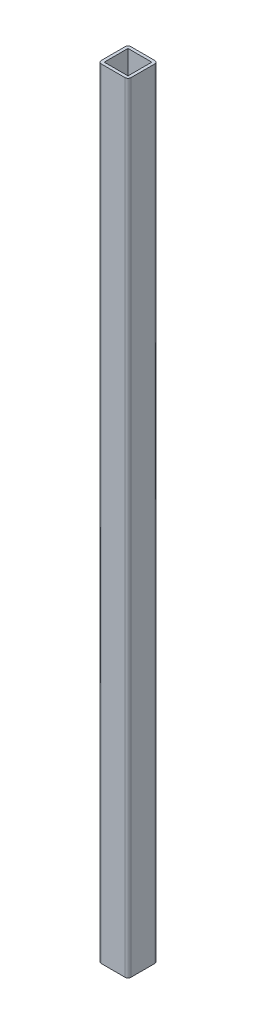
ISO-10303-21;
HEADER;
FILE_DESCRIPTION(('STEP AP214'),'2;1');
FILE_NAME('part.step','',(''),(''),'','','');
FILE_SCHEMA(('AUTOMOTIVE_DESIGN { 1 0 10303 214 1 1 1 1 }'));
ENDSEC;
DATA;
#1=APPLICATION_CONTEXT('core data for automotive mechanical design processes');
#2=APPLICATION_PROTOCOL_DEFINITION('international standard','automotive_design',2000,#1);
#3=PRODUCT_CONTEXT('',#1,'mechanical');
#4=PRODUCT('Part','Part','',(#3));
#5=PRODUCT_RELATED_PRODUCT_CATEGORY('part','',(#4));
#6=PRODUCT_DEFINITION_FORMATION('','',#4);
#7=PRODUCT_DEFINITION_CONTEXT('part definition',#1,'design');
#8=PRODUCT_DEFINITION('design','',#6,#7);
#9=PRODUCT_DEFINITION_SHAPE('','',#8);
#10=(LENGTH_UNIT() NAMED_UNIT(*) SI_UNIT(.MILLI.,.METRE.));
#11=(NAMED_UNIT(*) PLANE_ANGLE_UNIT() SI_UNIT($,.RADIAN.));
#12=(NAMED_UNIT(*) SI_UNIT($,.STERADIAN.) SOLID_ANGLE_UNIT());
#13=UNCERTAINTY_MEASURE_WITH_UNIT(LENGTH_MEASURE(1.E-05),#10,'distance_accuracy_value','');
#14=(GEOMETRIC_REPRESENTATION_CONTEXT(3) GLOBAL_UNCERTAINTY_ASSIGNED_CONTEXT((#13)) GLOBAL_UNIT_ASSIGNED_CONTEXT((#10,
#11,#12)) REPRESENTATION_CONTEXT('',''));
#15=CARTESIAN_POINT('',(0.,0.,0.));
#16=DIRECTION('',(0.,0.,1.));
#17=DIRECTION('',(1.,0.,0.));
#18=AXIS2_PLACEMENT_3D('',#15,#16,#17);
#19=CARTESIAN_POINT('',(-15.875,0.,-15.875));
#20=DIRECTION('',(-1.,0.,0.));
#21=DIRECTION('',(0.,0.,1.));
#22=AXIS2_PLACEMENT_3D('',#19,#20,#21);
#23=PLANE('',#22);
#24=DIRECTION('',(0.,-1.,0.));
#25=VECTOR('',#24,1.);
#26=CARTESIAN_POINT('',(-15.875,1916.24966,12.7));
#27=LINE('',#26,#25);
#28=CARTESIAN_POINT('',(-15.875,831.85,12.7));
#29=VERTEX_POINT('',#28);
#30=CARTESIAN_POINT('',(-15.875,0.,12.7));
#31=VERTEX_POINT('',#30);
#32=EDGE_CURVE('E167',#29,#31,#27,.T.);
#33=ORIENTED_EDGE('',*,*,#32,.F.);
#34=DIRECTION('',(0.,0.,1.));
#35=VECTOR('',#34,1.);
#36=CARTESIAN_POINT('',(-15.875,831.85,0.));
#37=LINE('',#36,#35);
#38=CARTESIAN_POINT('',(-15.875,831.85,-12.7));
#39=VERTEX_POINT('',#38);
#40=EDGE_CURVE('E99',#39,#29,#37,.T.);
#41=ORIENTED_EDGE('',*,*,#40,.F.);
#42=DIRECTION('',(0.,-1.,0.));
#43=VECTOR('',#42,1.);
#44=CARTESIAN_POINT('',(-15.875,1916.24966,-12.7));
#45=LINE('',#44,#43);
#46=CARTESIAN_POINT('',(-15.875,0.,-12.7));
#47=VERTEX_POINT('',#46);
#48=EDGE_CURVE('E94',#47,#39,#45,.F.);
#49=ORIENTED_EDGE('',*,*,#48,.F.);
#50=DIRECTION('',(0.,0.,1.));
#51=VECTOR('',#50,1.);
#52=CARTESIAN_POINT('',(-15.875,0.,0.));
#53=LINE('',#52,#51);
#54=EDGE_CURVE('E96',#47,#31,#53,.T.);
#55=ORIENTED_EDGE('',*,*,#54,.T.);
#56=EDGE_LOOP('',(#33,#41,#49,#55));
#57=FACE_BOUND('',#56,.T.);
#58=ADVANCED_FACE('F16',(#57),#23,.T.);
#59=CARTESIAN_POINT('',(-12.7,1916.24966,12.7));
#60=DIRECTION('',(0.,-1.,0.));
#61=DIRECTION('',(0.,0.,-1.));
#62=AXIS2_PLACEMENT_3D('',#59,#60,#61);
#63=CYLINDRICAL_SURFACE('',#62,3.175);
#64=CARTESIAN_POINT('',(-12.7,831.85,12.7));
#65=DIRECTION('',(0.,-1.,0.));
#66=DIRECTION('',(0.,0.,-1.));
#67=AXIS2_PLACEMENT_3D('',#64,#65,#66);
#68=CIRCLE('',#67,3.175);
#69=CARTESIAN_POINT('',(-12.7,831.85,15.875));
#70=VERTEX_POINT('',#69);
#71=EDGE_CURVE('E145',#29,#70,#68,.F.);
#72=ORIENTED_EDGE('',*,*,#71,.F.);
#73=ORIENTED_EDGE('',*,*,#32,.T.);
#74=CARTESIAN_POINT('',(-12.7,0.,12.7));
#75=DIRECTION('',(0.,-1.,0.));
#76=DIRECTION('',(0.,0.,-1.));
#77=AXIS2_PLACEMENT_3D('',#74,#75,#76);
#78=CIRCLE('',#77,3.175);
#79=CARTESIAN_POINT('',(-12.7,0.,15.875));
#80=VERTEX_POINT('',#79);
#81=EDGE_CURVE('E110',#31,#80,#78,.F.);
#82=ORIENTED_EDGE('',*,*,#81,.T.);
#83=DIRECTION('',(0.,1.,0.));
#84=VECTOR('',#83,1.);
#85=CARTESIAN_POINT('',(-12.7,0.,15.875));
#86=LINE('',#85,#84);
#87=EDGE_CURVE('E164',#70,#80,#86,.F.);
#88=ORIENTED_EDGE('',*,*,#87,.F.);
#89=EDGE_LOOP('',(#72,#73,#82,#88));
#90=FACE_BOUND('',#89,.T.);
#91=ADVANCED_FACE('F182',(#90),#63,.T.);
#92=CARTESIAN_POINT('',(-15.875,0.,15.875));
#93=DIRECTION('',(0.,0.,1.));
#94=DIRECTION('',(1.,0.,0.));
#95=AXIS2_PLACEMENT_3D('',#92,#93,#94);
#96=PLANE('',#95);
#97=DIRECTION('',(0.,-1.,0.));
#98=VECTOR('',#97,1.);
#99=CARTESIAN_POINT('',(12.7,1916.24966,15.875));
#100=LINE('',#99,#98);
#101=CARTESIAN_POINT('',(12.7,831.85,15.875));
#102=VERTEX_POINT('',#101);
#103=CARTESIAN_POINT('',(12.7,0.,15.875));
#104=VERTEX_POINT('',#103);
#105=EDGE_CURVE('E161',#102,#104,#100,.T.);
#106=ORIENTED_EDGE('',*,*,#105,.F.);
#107=DIRECTION('',(1.,0.,0.));
#108=VECTOR('',#107,1.);
#109=CARTESIAN_POINT('',(0.,831.85,15.875));
#110=LINE('',#109,#108);
#111=EDGE_CURVE('E142',#70,#102,#110,.T.);
#112=ORIENTED_EDGE('',*,*,#111,.F.);
#113=ORIENTED_EDGE('',*,*,#87,.T.);
#114=DIRECTION('',(1.,0.,0.));
#115=VECTOR('',#114,1.);
#116=CARTESIAN_POINT('',(0.,0.,15.875));
#117=LINE('',#116,#115);
#118=EDGE_CURVE('E113',#80,#104,#117,.T.);
#119=ORIENTED_EDGE('',*,*,#118,.T.);
#120=EDGE_LOOP('',(#106,#112,#113,#119));
#121=FACE_BOUND('',#120,.T.);
#122=ADVANCED_FACE('F184',(#121),#96,.T.);
#123=CARTESIAN_POINT('',(12.7,1916.24966,12.7));
#124=DIRECTION('',(0.,-1.,0.));
#125=DIRECTION('',(0.,0.,-1.));
#126=AXIS2_PLACEMENT_3D('',#123,#124,#125);
#127=CYLINDRICAL_SURFACE('',#126,3.175);
#128=CARTESIAN_POINT('',(12.7,831.85,12.7));
#129=DIRECTION('',(0.,-1.,0.));
#130=DIRECTION('',(0.,0.,-1.));
#131=AXIS2_PLACEMENT_3D('',#128,#129,#130);
#132=CIRCLE('',#131,3.175);
#133=CARTESIAN_POINT('',(15.875,831.85,12.7));
#134=VERTEX_POINT('',#133);
#135=EDGE_CURVE('E141',#102,#134,#132,.F.);
#136=ORIENTED_EDGE('',*,*,#135,.F.);
#137=ORIENTED_EDGE('',*,*,#105,.T.);
#138=CARTESIAN_POINT('',(12.7,0.,12.7));
#139=DIRECTION('',(0.,-1.,0.));
#140=DIRECTION('',(0.,0.,-1.));
#141=AXIS2_PLACEMENT_3D('',#138,#139,#140);
#142=CIRCLE('',#141,3.175);
#143=CARTESIAN_POINT('',(15.875,0.,12.7));
#144=VERTEX_POINT('',#143);
#145=EDGE_CURVE('E171',#104,#144,#142,.F.);
#146=ORIENTED_EDGE('',*,*,#145,.T.);
#147=DIRECTION('',(0.,1.,0.));
#148=VECTOR('',#147,1.);
#149=CARTESIAN_POINT('',(15.875,0.,12.7));
#150=LINE('',#149,#148);
#151=EDGE_CURVE('E157',#134,#144,#150,.F.);
#152=ORIENTED_EDGE('',*,*,#151,.F.);
#153=EDGE_LOOP('',(#136,#137,#146,#152));
#154=FACE_BOUND('',#153,.T.);
#155=ADVANCED_FACE('F188',(#154),#127,.T.);
#156=CARTESIAN_POINT('',(15.875,0.,15.875));
#157=DIRECTION('',(1.,0.,0.));
#158=DIRECTION('',(0.,0.,-1.));
#159=AXIS2_PLACEMENT_3D('',#156,#157,#158);
#160=PLANE('',#159);
#161=ORIENTED_EDGE('',*,*,#151,.T.);
#162=DIRECTION('',(0.,0.,1.));
#163=VECTOR('',#162,1.);
#164=CARTESIAN_POINT('',(15.875,0.,0.));
#165=LINE('',#164,#163);
#166=CARTESIAN_POINT('',(15.875,0.,-12.7));
#167=VERTEX_POINT('',#166);
#168=EDGE_CURVE('E170',#144,#167,#165,.F.);
#169=ORIENTED_EDGE('',*,*,#168,.T.);
#170=DIRECTION('',(0.,-1.,0.));
#171=VECTOR('',#170,1.);
#172=CARTESIAN_POINT('',(15.875,1916.24966,-12.7));
#173=LINE('',#172,#171);
#174=CARTESIAN_POINT('',(15.875,831.85,-12.7));
#175=VERTEX_POINT('',#174);
#176=EDGE_CURVE('E111',#175,#167,#173,.T.);
#177=ORIENTED_EDGE('',*,*,#176,.F.);
#178=DIRECTION('',(0.,0.,1.));
#179=VECTOR('',#178,1.);
#180=CARTESIAN_POINT('',(15.875,831.85,0.));
#181=LINE('',#180,#179);
#182=EDGE_CURVE('E139',#134,#175,#181,.F.);
#183=ORIENTED_EDGE('',*,*,#182,.F.);
#184=EDGE_LOOP('',(#161,#169,#177,#183));
#185=FACE_BOUND('',#184,.T.);
#186=ADVANCED_FACE('F193',(#185),#160,.T.);
#187=CARTESIAN_POINT('',(12.7,0.,-12.7));
#188=DIRECTION('',(-1.,0.,0.));
#189=DIRECTION('',(0.,0.,1.));
#190=AXIS2_PLACEMENT_3D('',#187,#188,#189);
#191=PLANE('',#190);
#192=DIRECTION('',(0.,0.,1.));
#193=VECTOR('',#192,1.);
#194=CARTESIAN_POINT('',(12.7,831.85,0.));
#195=LINE('',#194,#193);
#196=CARTESIAN_POINT('',(12.7,831.85,-12.7));
#197=VERTEX_POINT('',#196);
#198=CARTESIAN_POINT('',(12.7,831.85,12.7));
#199=VERTEX_POINT('',#198);
#200=EDGE_CURVE('E133',#197,#199,#195,.T.);
#201=ORIENTED_EDGE('',*,*,#200,.F.);
#202=DIRECTION('',(0.,1.,0.));
#203=VECTOR('',#202,1.);
#204=CARTESIAN_POINT('',(12.7,0.,-12.7));
#205=LINE('',#204,#203);
#206=CARTESIAN_POINT('',(12.7,0.,-12.7));
#207=VERTEX_POINT('',#206);
#208=EDGE_CURVE('E149',#207,#197,#205,.T.);
#209=ORIENTED_EDGE('',*,*,#208,.F.);
#210=DIRECTION('',(0.,0.,1.));
#211=VECTOR('',#210,1.);
#212=CARTESIAN_POINT('',(12.7,0.,0.));
#213=LINE('',#212,#211);
#214=CARTESIAN_POINT('',(12.7,0.,12.7));
#215=VERTEX_POINT('',#214);
#216=EDGE_CURVE('E105',#207,#215,#213,.T.);
#217=ORIENTED_EDGE('',*,*,#216,.T.);
#218=DIRECTION('',(0.,1.,0.));
#219=VECTOR('',#218,1.);
#220=CARTESIAN_POINT('',(12.7,0.,12.7));
#221=LINE('',#220,#219);
#222=EDGE_CURVE('E155',#199,#215,#221,.F.);
#223=ORIENTED_EDGE('',*,*,#222,.F.);
#224=EDGE_LOOP('',(#201,#209,#217,#223));
#225=FACE_BOUND('',#224,.T.);
#226=ADVANCED_FACE('F221',(#225),#191,.T.);
#227=CARTESIAN_POINT('',(12.7,0.,12.7));
#228=DIRECTION('',(0.,0.,-1.));
#229=DIRECTION('',(-1.,0.,0.));
#230=AXIS2_PLACEMENT_3D('',#227,#228,#229);
#231=PLANE('',#230);
#232=DIRECTION('',(1.,0.,0.));
#233=VECTOR('',#232,1.);
#234=CARTESIAN_POINT('',(0.,831.85,12.7));
#235=LINE('',#234,#233);
#236=CARTESIAN_POINT('',(-12.7,831.85,12.7));
#237=VERTEX_POINT('',#236);
#238=EDGE_CURVE('E130',#199,#237,#235,.F.);
#239=ORIENTED_EDGE('',*,*,#238,.F.);
#240=ORIENTED_EDGE('',*,*,#222,.T.);
#241=DIRECTION('',(1.,0.,0.));
#242=VECTOR('',#241,1.);
#243=CARTESIAN_POINT('',(0.,0.,12.7));
#244=LINE('',#243,#242);
#245=CARTESIAN_POINT('',(-12.7,0.,12.7));
#246=VERTEX_POINT('',#245);
#247=EDGE_CURVE('E231',#215,#246,#244,.F.);
#248=ORIENTED_EDGE('',*,*,#247,.T.);
#249=DIRECTION('',(0.,1.,0.));
#250=VECTOR('',#249,1.);
#251=CARTESIAN_POINT('',(-12.7,0.,12.7));
#252=LINE('',#251,#250);
#253=EDGE_CURVE('E152',#237,#246,#252,.F.);
#254=ORIENTED_EDGE('',*,*,#253,.F.);
#255=EDGE_LOOP('',(#239,#240,#248,#254));
#256=FACE_BOUND('',#255,.T.);
#257=ADVANCED_FACE('F236',(#256),#231,.T.);
#258=CARTESIAN_POINT('',(-12.7,0.,12.7));
#259=DIRECTION('',(1.,0.,0.));
#260=DIRECTION('',(0.,0.,-1.));
#261=AXIS2_PLACEMENT_3D('',#258,#259,#260);
#262=PLANE('',#261);
#263=DIRECTION('',(0.,0.,1.));
#264=VECTOR('',#263,1.);
#265=CARTESIAN_POINT('',(-12.7,831.85,0.));
#266=LINE('',#265,#264);
#267=CARTESIAN_POINT('',(-12.7,831.85,-12.7));
#268=VERTEX_POINT('',#267);
#269=EDGE_CURVE('E127',#237,#268,#266,.F.);
#270=ORIENTED_EDGE('',*,*,#269,.F.);
#271=ORIENTED_EDGE('',*,*,#253,.T.);
#272=DIRECTION('',(0.,0.,1.));
#273=VECTOR('',#272,1.);
#274=CARTESIAN_POINT('',(-12.7,0.,0.));
#275=LINE('',#274,#273);
#276=CARTESIAN_POINT('',(-12.7,0.,-12.7));
#277=VERTEX_POINT('',#276);
#278=EDGE_CURVE('E226',#246,#277,#275,.F.);
#279=ORIENTED_EDGE('',*,*,#278,.T.);
#280=DIRECTION('',(0.,1.,0.));
#281=VECTOR('',#280,1.);
#282=CARTESIAN_POINT('',(-12.7,0.,-12.7));
#283=LINE('',#282,#281);
#284=EDGE_CURVE('E100',#268,#277,#283,.F.);
#285=ORIENTED_EDGE('',*,*,#284,.F.);
#286=EDGE_LOOP('',(#270,#271,#279,#285));
#287=FACE_BOUND('',#286,.T.);
#288=ADVANCED_FACE('F224',(#287),#262,.T.);
#289=CARTESIAN_POINT('',(-12.7,0.,-12.7));
#290=DIRECTION('',(0.,0.,1.));
#291=DIRECTION('',(1.,0.,0.));
#292=AXIS2_PLACEMENT_3D('',#289,#290,#291);
#293=PLANE('',#292);
#294=DIRECTION('',(1.,0.,0.));
#295=VECTOR('',#294,1.);
#296=CARTESIAN_POINT('',(0.,831.85,-12.7));
#297=LINE('',#296,#295);
#298=EDGE_CURVE('E136',#268,#197,#297,.T.);
#299=ORIENTED_EDGE('',*,*,#298,.F.);
#300=ORIENTED_EDGE('',*,*,#284,.T.);
#301=DIRECTION('',(1.,0.,0.));
#302=VECTOR('',#301,1.);
#303=CARTESIAN_POINT('',(0.,0.,-12.7));
#304=LINE('',#303,#302);
#305=EDGE_CURVE('E124',#277,#207,#304,.T.);
#306=ORIENTED_EDGE('',*,*,#305,.T.);
#307=ORIENTED_EDGE('',*,*,#208,.T.);
#308=EDGE_LOOP('',(#299,#300,#306,#307));
#309=FACE_BOUND('',#308,.T.);
#310=ADVANCED_FACE('F218',(#309),#293,.T.);
#311=CARTESIAN_POINT('',(-12.7,1916.24966,-12.7));
#312=DIRECTION('',(0.,-1.,0.));
#313=DIRECTION('',(0.,0.,-1.));
#314=AXIS2_PLACEMENT_3D('',#311,#312,#313);
#315=CYLINDRICAL_SURFACE('',#314,3.175);
#316=CARTESIAN_POINT('',(-12.7,831.85,-12.7));
#317=DIRECTION('',(0.,-1.,0.));
#318=DIRECTION('',(0.,0.,-1.));
#319=AXIS2_PLACEMENT_3D('',#316,#317,#318);
#320=CIRCLE('',#319,3.175);
#321=CARTESIAN_POINT('',(-12.7,831.85,-15.875));
#322=VERTEX_POINT('',#321);
#323=EDGE_CURVE('E19',#322,#39,#320,.F.);
#324=ORIENTED_EDGE('',*,*,#323,.F.);
#325=DIRECTION('',(0.,1.,0.));
#326=VECTOR('',#325,1.);
#327=CARTESIAN_POINT('',(-12.7,0.,-15.875));
#328=LINE('',#327,#326);
#329=CARTESIAN_POINT('',(-12.7,0.,-15.875));
#330=VERTEX_POINT('',#329);
#331=EDGE_CURVE('E83',#330,#322,#328,.T.);
#332=ORIENTED_EDGE('',*,*,#331,.F.);
#333=CARTESIAN_POINT('',(-12.7,0.,-12.7));
#334=DIRECTION('',(0.,-1.,0.));
#335=DIRECTION('',(0.,0.,-1.));
#336=AXIS2_PLACEMENT_3D('',#333,#334,#335);
#337=CIRCLE('',#336,3.175);
#338=EDGE_CURVE('E102',#330,#47,#337,.F.);
#339=ORIENTED_EDGE('',*,*,#338,.T.);
#340=ORIENTED_EDGE('',*,*,#48,.T.);
#341=EDGE_LOOP('',(#324,#332,#339,#340));
#342=FACE_BOUND('',#341,.T.);
#343=ADVANCED_FACE('F103',(#342),#315,.T.);
#344=CARTESIAN_POINT('',(0.,831.85,0.));
#345=DIRECTION('',(0.,1.,0.));
#346=DIRECTION('',(0.,0.,1.));
#347=AXIS2_PLACEMENT_3D('',#344,#345,#346);
#348=PLANE('',#347);
#349=ORIENTED_EDGE('',*,*,#238,.T.);
#350=ORIENTED_EDGE('',*,*,#269,.T.);
#351=ORIENTED_EDGE('',*,*,#298,.T.);
#352=ORIENTED_EDGE('',*,*,#200,.T.);
#353=EDGE_LOOP('',(#349,#350,#351,#352));
#354=FACE_BOUND('',#353,.T.);
#355=CARTESIAN_POINT('',(12.7,831.85,-12.7));
#356=DIRECTION('',(0.,-1.,0.));
#357=DIRECTION('',(0.,0.,-1.));
#358=AXIS2_PLACEMENT_3D('',#355,#356,#357);
#359=CIRCLE('',#358,3.175);
#360=CARTESIAN_POINT('',(12.7,831.85,-15.875));
#361=VERTEX_POINT('',#360);
#362=EDGE_CURVE('E115',#361,#175,#359,.T.);
#363=ORIENTED_EDGE('',*,*,#362,.F.);
#364=DIRECTION('',(-1.,0.,0.));
#365=VECTOR('',#364,1.);
#366=CARTESIAN_POINT('',(15.875,831.85,-15.875));
#367=LINE('',#366,#365);
#368=EDGE_CURVE('E121',#322,#361,#367,.F.);
#369=ORIENTED_EDGE('',*,*,#368,.F.);
#370=ORIENTED_EDGE('',*,*,#323,.T.);
#371=ORIENTED_EDGE('',*,*,#40,.T.);
#372=ORIENTED_EDGE('',*,*,#71,.T.);
#373=ORIENTED_EDGE('',*,*,#111,.T.);
#374=ORIENTED_EDGE('',*,*,#135,.T.);
#375=ORIENTED_EDGE('',*,*,#182,.T.);
#376=EDGE_LOOP('',(#363,#369,#370,#371,#372,#373,#374,#375));
#377=FACE_BOUND('',#376,.T.);
#378=ADVANCED_FACE('F179',(#354,#377),#348,.T.);
#379=CARTESIAN_POINT('',(12.7,1916.24966,-12.7));
#380=DIRECTION('',(0.,-1.,0.));
#381=DIRECTION('',(0.,0.,-1.));
#382=AXIS2_PLACEMENT_3D('',#379,#380,#381);
#383=CYLINDRICAL_SURFACE('',#382,3.175);
#384=ORIENTED_EDGE('',*,*,#362,.T.);
#385=ORIENTED_EDGE('',*,*,#176,.T.);
#386=CARTESIAN_POINT('',(12.7,0.,-12.7));
#387=DIRECTION('',(0.,-1.,0.));
#388=DIRECTION('',(0.,0.,-1.));
#389=AXIS2_PLACEMENT_3D('',#386,#387,#388);
#390=CIRCLE('',#389,3.175);
#391=CARTESIAN_POINT('',(12.7,0.,-15.875));
#392=VERTEX_POINT('',#391);
#393=EDGE_CURVE('E34',#167,#392,#390,.F.);
#394=ORIENTED_EDGE('',*,*,#393,.T.);
#395=DIRECTION('',(0.,1.,0.));
#396=VECTOR('',#395,1.);
#397=CARTESIAN_POINT('',(12.7,0.,-15.875));
#398=LINE('',#397,#396);
#399=EDGE_CURVE('E25',#361,#392,#398,.F.);
#400=ORIENTED_EDGE('',*,*,#399,.F.);
#401=EDGE_LOOP('',(#384,#385,#394,#400));
#402=FACE_BOUND('',#401,.T.);
#403=ADVANCED_FACE('F195',(#402),#383,.T.);
#404=CARTESIAN_POINT('',(0.,0.,0.));
#405=DIRECTION('',(0.,1.,0.));
#406=DIRECTION('',(0.,0.,1.));
#407=AXIS2_PLACEMENT_3D('',#404,#405,#406);
#408=PLANE('',#407);
#409=ORIENTED_EDGE('',*,*,#278,.F.);
#410=ORIENTED_EDGE('',*,*,#247,.F.);
#411=ORIENTED_EDGE('',*,*,#216,.F.);
#412=ORIENTED_EDGE('',*,*,#305,.F.);
#413=EDGE_LOOP('',(#409,#410,#411,#412));
#414=FACE_BOUND('',#413,.T.);
#415=DIRECTION('',(-1.,0.,0.));
#416=VECTOR('',#415,1.);
#417=CARTESIAN_POINT('',(15.875,0.,-15.875));
#418=LINE('',#417,#416);
#419=EDGE_CURVE('E11',#392,#330,#418,.T.);
#420=ORIENTED_EDGE('',*,*,#419,.F.);
#421=ORIENTED_EDGE('',*,*,#393,.F.);
#422=ORIENTED_EDGE('',*,*,#168,.F.);
#423=ORIENTED_EDGE('',*,*,#145,.F.);
#424=ORIENTED_EDGE('',*,*,#118,.F.);
#425=ORIENTED_EDGE('',*,*,#81,.F.);
#426=ORIENTED_EDGE('',*,*,#54,.F.);
#427=ORIENTED_EDGE('',*,*,#338,.F.);
#428=EDGE_LOOP('',(#420,#421,#422,#423,#424,#425,#426,#427));
#429=FACE_BOUND('',#428,.T.);
#430=ADVANCED_FACE('F108',(#414,#429),#408,.F.);
#431=CARTESIAN_POINT('',(15.875,0.,-15.875));
#432=DIRECTION('',(0.,0.,-1.));
#433=DIRECTION('',(-1.,0.,0.));
#434=AXIS2_PLACEMENT_3D('',#431,#432,#433);
#435=PLANE('',#434);
#436=ORIENTED_EDGE('',*,*,#399,.T.);
#437=ORIENTED_EDGE('',*,*,#419,.T.);
#438=ORIENTED_EDGE('',*,*,#331,.T.);
#439=ORIENTED_EDGE('',*,*,#368,.T.);
#440=EDGE_LOOP('',(#436,#437,#438,#439));
#441=FACE_BOUND('',#440,.T.);
#442=ADVANCED_FACE('F197',(#441),#435,.T.);
#443=CLOSED_SHELL('',(#58,#91,#122,#155,#186,#226,#257,#288,#310,#343,#378,#403,#430,#442));
#444=MANIFOLD_SOLID_BREP('B1',#443);
#445=ADVANCED_BREP_SHAPE_REPRESENTATION('',(#18,#444),#14);
#446=SHAPE_DEFINITION_REPRESENTATION(#9,#445);
ENDSEC;
END-ISO-10303-21;
